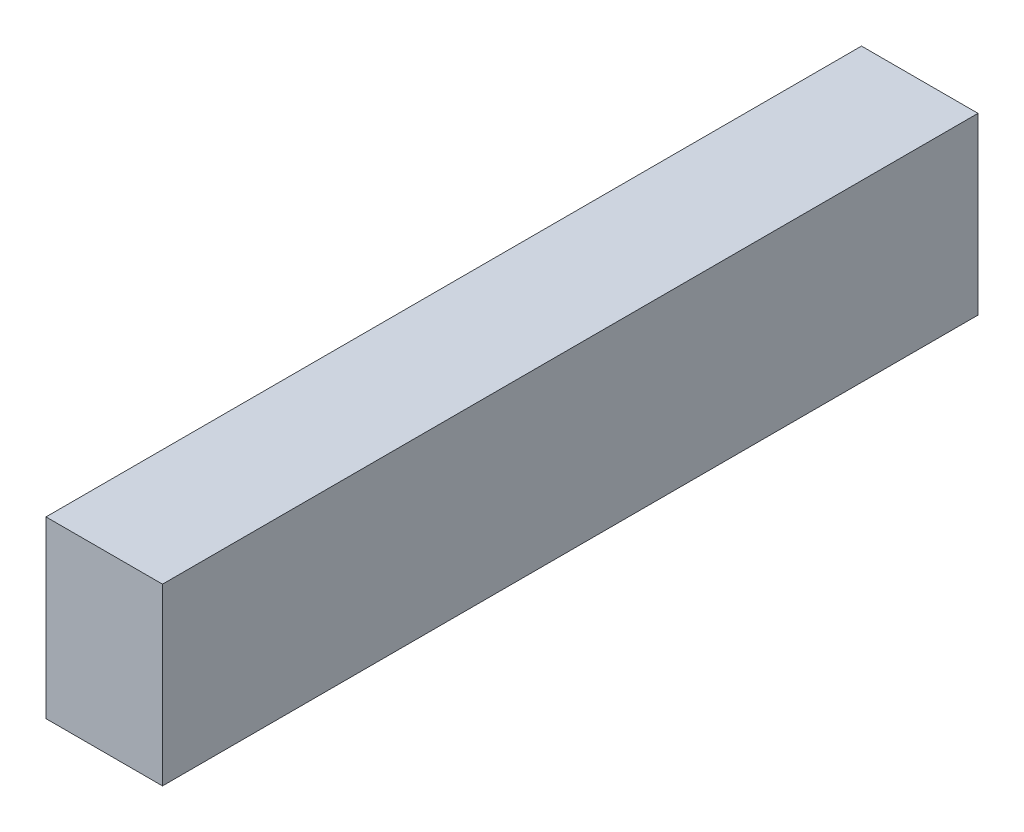
ISO-10303-21;
HEADER;
FILE_DESCRIPTION(('STEP AP214'),'2;1');
FILE_NAME('part.step','',(''),(''),'','','');
FILE_SCHEMA(('AUTOMOTIVE_DESIGN { 1 0 10303 214 1 1 1 1 }'));
ENDSEC;
DATA;
#1=APPLICATION_CONTEXT('core data for automotive mechanical design processes');
#2=APPLICATION_PROTOCOL_DEFINITION('international standard','automotive_design',2000,#1);
#3=PRODUCT_CONTEXT('',#1,'mechanical');
#4=PRODUCT('Part','Part','',(#3));
#5=PRODUCT_RELATED_PRODUCT_CATEGORY('part','',(#4));
#6=PRODUCT_DEFINITION_FORMATION('','',#4);
#7=PRODUCT_DEFINITION_CONTEXT('part definition',#1,'design');
#8=PRODUCT_DEFINITION('design','',#6,#7);
#9=PRODUCT_DEFINITION_SHAPE('','',#8);
#10=(LENGTH_UNIT() NAMED_UNIT(*) SI_UNIT(.MILLI.,.METRE.));
#11=(NAMED_UNIT(*) PLANE_ANGLE_UNIT() SI_UNIT($,.RADIAN.));
#12=(NAMED_UNIT(*) SI_UNIT($,.STERADIAN.) SOLID_ANGLE_UNIT());
#13=UNCERTAINTY_MEASURE_WITH_UNIT(LENGTH_MEASURE(1.E-05),#10,'distance_accuracy_value','');
#14=(GEOMETRIC_REPRESENTATION_CONTEXT(3) GLOBAL_UNCERTAINTY_ASSIGNED_CONTEXT((#13)) GLOBAL_UNIT_ASSIGNED_CONTEXT((#10,
#11,#12)) REPRESENTATION_CONTEXT('',''));
#15=CARTESIAN_POINT('',(0.,0.,0.));
#16=DIRECTION('',(0.,0.,1.));
#17=DIRECTION('',(1.,0.,0.));
#18=AXIS2_PLACEMENT_3D('',#15,#16,#17);
#19=CARTESIAN_POINT('',(170.,1254.,-300.));
#20=DIRECTION('',(-1.,0.,0.));
#21=DIRECTION('',(0.,0.,1.));
#22=AXIS2_PLACEMENT_3D('',#19,#20,#21);
#23=PLANE('',#22);
#24=DIRECTION('',(0.,-1.,0.));
#25=VECTOR('',#24,1.);
#26=CARTESIAN_POINT('',(170.,1254.,-160.));
#27=LINE('',#26,#25);
#28=CARTESIAN_POINT('',(170.,1284.,-160.));
#29=VERTEX_POINT('',#28);
#30=CARTESIAN_POINT('',(170.,1254.,-160.));
#31=VERTEX_POINT('',#30);
#32=EDGE_CURVE('E103',#29,#31,#27,.T.);
#33=ORIENTED_EDGE('',*,*,#32,.F.);
#34=DIRECTION('',(0.,0.,1.));
#35=VECTOR('',#34,1.);
#36=CARTESIAN_POINT('',(170.,1284.,-300.));
#37=LINE('',#36,#35);
#38=CARTESIAN_POINT('',(170.,1284.,-300.));
#39=VERTEX_POINT('',#38);
#40=EDGE_CURVE('E11',#39,#29,#37,.T.);
#41=ORIENTED_EDGE('',*,*,#40,.F.);
#42=DIRECTION('',(0.,-1.,0.));
#43=VECTOR('',#42,1.);
#44=CARTESIAN_POINT('',(170.,1254.,-300.));
#45=LINE('',#44,#43);
#46=CARTESIAN_POINT('',(170.,1254.,-300.));
#47=VERTEX_POINT('',#46);
#48=EDGE_CURVE('E97',#39,#47,#45,.T.);
#49=ORIENTED_EDGE('',*,*,#48,.T.);
#50=DIRECTION('',(0.,0.,1.));
#51=VECTOR('',#50,1.);
#52=CARTESIAN_POINT('',(170.,1254.,-300.));
#53=LINE('',#52,#51);
#54=EDGE_CURVE('E42',#47,#31,#53,.T.);
#55=ORIENTED_EDGE('',*,*,#54,.T.);
#56=EDGE_LOOP('',(#33,#41,#49,#55));
#57=FACE_BOUND('',#56,.T.);
#58=ADVANCED_FACE('F39',(#57),#23,.T.);
#59=CARTESIAN_POINT('',(170.,1284.,-300.));
#60=DIRECTION('',(0.,1.,0.));
#61=DIRECTION('',(0.,0.,1.));
#62=AXIS2_PLACEMENT_3D('',#59,#60,#61);
#63=PLANE('',#62);
#64=DIRECTION('',(-1.,0.,0.));
#65=VECTOR('',#64,1.);
#66=CARTESIAN_POINT('',(170.,1284.,-160.));
#67=LINE('',#66,#65);
#68=CARTESIAN_POINT('',(190.,1284.,-160.));
#69=VERTEX_POINT('',#68);
#70=EDGE_CURVE('E99',#69,#29,#67,.T.);
#71=ORIENTED_EDGE('',*,*,#70,.F.);
#72=DIRECTION('',(0.,0.,1.));
#73=VECTOR('',#72,1.);
#74=CARTESIAN_POINT('',(190.,1284.,-300.));
#75=LINE('',#74,#73);
#76=CARTESIAN_POINT('',(190.,1284.,-300.));
#77=VERTEX_POINT('',#76);
#78=EDGE_CURVE('E48',#77,#69,#75,.T.);
#79=ORIENTED_EDGE('',*,*,#78,.F.);
#80=DIRECTION('',(-1.,0.,0.));
#81=VECTOR('',#80,1.);
#82=CARTESIAN_POINT('',(170.,1284.,-300.));
#83=LINE('',#82,#81);
#84=EDGE_CURVE('E94',#77,#39,#83,.T.);
#85=ORIENTED_EDGE('',*,*,#84,.T.);
#86=ORIENTED_EDGE('',*,*,#40,.T.);
#87=EDGE_LOOP('',(#71,#79,#85,#86));
#88=FACE_BOUND('',#87,.T.);
#89=ADVANCED_FACE('F113',(#88),#63,.T.);
#90=CARTESIAN_POINT('',(190.,1254.,-300.));
#91=DIRECTION('',(1.,0.,0.));
#92=DIRECTION('',(0.,0.,-1.));
#93=AXIS2_PLACEMENT_3D('',#90,#91,#92);
#94=PLANE('',#93);
#95=DIRECTION('',(0.,1.,0.));
#96=VECTOR('',#95,1.);
#97=CARTESIAN_POINT('',(190.,1254.,-160.));
#98=LINE('',#97,#96);
#99=CARTESIAN_POINT('',(190.,1254.,-160.));
#100=VERTEX_POINT('',#99);
#101=EDGE_CURVE('E89',#100,#69,#98,.T.);
#102=ORIENTED_EDGE('',*,*,#101,.F.);
#103=DIRECTION('',(0.,0.,1.));
#104=VECTOR('',#103,1.);
#105=CARTESIAN_POINT('',(190.,1254.,-300.));
#106=LINE('',#105,#104);
#107=CARTESIAN_POINT('',(190.,1254.,-300.));
#108=VERTEX_POINT('',#107);
#109=EDGE_CURVE('E84',#108,#100,#106,.T.);
#110=ORIENTED_EDGE('',*,*,#109,.F.);
#111=DIRECTION('',(0.,1.,0.));
#112=VECTOR('',#111,1.);
#113=CARTESIAN_POINT('',(190.,1254.,-300.));
#114=LINE('',#113,#112);
#115=EDGE_CURVE('E87',#108,#77,#114,.T.);
#116=ORIENTED_EDGE('',*,*,#115,.T.);
#117=ORIENTED_EDGE('',*,*,#78,.T.);
#118=EDGE_LOOP('',(#102,#110,#116,#117));
#119=FACE_BOUND('',#118,.T.);
#120=ADVANCED_FACE('F86',(#119),#94,.T.);
#121=CARTESIAN_POINT('',(170.,1254.,-300.));
#122=DIRECTION('',(0.,-1.,0.));
#123=DIRECTION('',(0.,0.,-1.));
#124=AXIS2_PLACEMENT_3D('',#121,#122,#123);
#125=PLANE('',#124);
#126=DIRECTION('',(1.,0.,0.));
#127=VECTOR('',#126,1.);
#128=CARTESIAN_POINT('',(170.,1254.,-160.));
#129=LINE('',#128,#127);
#130=EDGE_CURVE('E106',#31,#100,#129,.T.);
#131=ORIENTED_EDGE('',*,*,#130,.F.);
#132=ORIENTED_EDGE('',*,*,#54,.F.);
#133=DIRECTION('',(1.,0.,0.));
#134=VECTOR('',#133,1.);
#135=CARTESIAN_POINT('',(170.,1254.,-300.));
#136=LINE('',#135,#134);
#137=EDGE_CURVE('E93',#47,#108,#136,.T.);
#138=ORIENTED_EDGE('',*,*,#137,.T.);
#139=ORIENTED_EDGE('',*,*,#109,.T.);
#140=EDGE_LOOP('',(#131,#132,#138,#139));
#141=FACE_BOUND('',#140,.T.);
#142=ADVANCED_FACE('F96',(#141),#125,.T.);
#143=CARTESIAN_POINT('',(0.,0.,-300.));
#144=DIRECTION('',(0.,0.,-1.));
#145=DIRECTION('',(-1.,0.,0.));
#146=AXIS2_PLACEMENT_3D('',#143,#144,#145);
#147=PLANE('',#146);
#148=ORIENTED_EDGE('',*,*,#48,.F.);
#149=ORIENTED_EDGE('',*,*,#84,.F.);
#150=ORIENTED_EDGE('',*,*,#115,.F.);
#151=ORIENTED_EDGE('',*,*,#137,.F.);
#152=EDGE_LOOP('',(#148,#149,#150,#151));
#153=FACE_BOUND('',#152,.T.);
#154=ADVANCED_FACE('F92',(#153),#147,.T.);
#155=CARTESIAN_POINT('',(0.,0.,-160.));
#156=DIRECTION('',(0.,0.,-1.));
#157=DIRECTION('',(-1.,0.,0.));
#158=AXIS2_PLACEMENT_3D('',#155,#156,#157);
#159=PLANE('',#158);
#160=ORIENTED_EDGE('',*,*,#32,.T.);
#161=ORIENTED_EDGE('',*,*,#130,.T.);
#162=ORIENTED_EDGE('',*,*,#101,.T.);
#163=ORIENTED_EDGE('',*,*,#70,.T.);
#164=EDGE_LOOP('',(#160,#161,#162,#163));
#165=FACE_BOUND('',#164,.T.);
#166=ADVANCED_FACE('F112',(#165),#159,.F.);
#167=CLOSED_SHELL('',(#58,#89,#120,#142,#154,#166));
#168=MANIFOLD_SOLID_BREP('B2',#167);
#169=ADVANCED_BREP_SHAPE_REPRESENTATION('',(#18,#168),#14);
#170=SHAPE_DEFINITION_REPRESENTATION(#9,#169);
ENDSEC;
END-ISO-10303-21;
